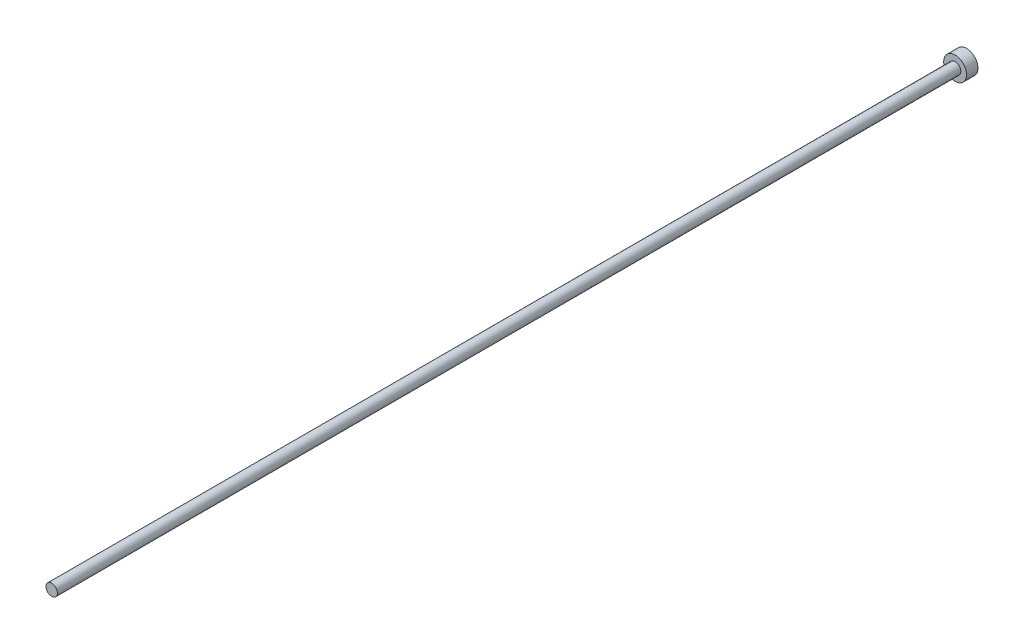
ISO-10303-21;
HEADER;
FILE_DESCRIPTION(('STEP AP214'),'2;1');
FILE_NAME('part.step','',(''),(''),'','','');
FILE_SCHEMA(('AUTOMOTIVE_DESIGN { 1 0 10303 214 1 1 1 1 }'));
ENDSEC;
DATA;
#1=APPLICATION_CONTEXT('core data for automotive mechanical design processes');
#2=APPLICATION_PROTOCOL_DEFINITION('international standard','automotive_design',2000,#1);
#3=PRODUCT_CONTEXT('',#1,'mechanical');
#4=PRODUCT('Part','Part','',(#3));
#5=PRODUCT_RELATED_PRODUCT_CATEGORY('part','',(#4));
#6=PRODUCT_DEFINITION_FORMATION('','',#4);
#7=PRODUCT_DEFINITION_CONTEXT('part definition',#1,'design');
#8=PRODUCT_DEFINITION('design','',#6,#7);
#9=PRODUCT_DEFINITION_SHAPE('','',#8);
#10=(LENGTH_UNIT() NAMED_UNIT(*) SI_UNIT(.MILLI.,.METRE.));
#11=(NAMED_UNIT(*) PLANE_ANGLE_UNIT() SI_UNIT($,.RADIAN.));
#12=(NAMED_UNIT(*) SI_UNIT($,.STERADIAN.) SOLID_ANGLE_UNIT());
#13=UNCERTAINTY_MEASURE_WITH_UNIT(LENGTH_MEASURE(1.E-05),#10,'distance_accuracy_value','');
#14=(GEOMETRIC_REPRESENTATION_CONTEXT(3) GLOBAL_UNCERTAINTY_ASSIGNED_CONTEXT((#13)) GLOBAL_UNIT_ASSIGNED_CONTEXT((#10,
#11,#12)) REPRESENTATION_CONTEXT('',''));
#15=CARTESIAN_POINT('',(0.,0.,0.));
#16=DIRECTION('',(0.,0.,1.));
#17=DIRECTION('',(1.,0.,0.));
#18=AXIS2_PLACEMENT_3D('',#15,#16,#17);
#19=CARTESIAN_POINT('',(0.,0.,-80.));
#20=DIRECTION('',(0.,0.,1.));
#21=DIRECTION('',(1.,0.,0.));
#22=AXIS2_PLACEMENT_3D('',#19,#20,#21);
#23=PLANE('',#22);
#24=CARTESIAN_POINT('',(0.,0.,-80.));
#25=DIRECTION('',(0.,0.,1.));
#26=DIRECTION('',(1.,0.,0.));
#27=AXIS2_PLACEMENT_3D('',#24,#25,#26);
#28=CIRCLE('',#27,2.);
#29=CARTESIAN_POINT('',(2.,0.,-80.));
#30=VERTEX_POINT('',#29);
#31=EDGE_CURVE('E10',#30,#30,#28,.T.);
#32=ORIENTED_EDGE('',*,*,#31,.F.);
#33=EDGE_LOOP('',(#32));
#34=FACE_BOUND('',#33,.T.);
#35=ADVANCED_FACE('F35',(#34),#23,.F.);
#36=CARTESIAN_POINT('',(0.,0.,80.));
#37=DIRECTION('',(0.,0.,1.));
#38=DIRECTION('',(1.,0.,0.));
#39=AXIS2_PLACEMENT_3D('',#36,#37,#38);
#40=CYLINDRICAL_SURFACE('',#39,2.);
#41=CARTESIAN_POINT('',(0.,0.,-78.));
#42=DIRECTION('',(0.,0.,1.));
#43=DIRECTION('',(1.,0.,0.));
#44=AXIS2_PLACEMENT_3D('',#41,#42,#43);
#45=CIRCLE('',#44,2.);
#46=CARTESIAN_POINT('',(2.,0.,-78.));
#47=VERTEX_POINT('',#46);
#48=EDGE_CURVE('E42',#47,#47,#45,.T.);
#49=ORIENTED_EDGE('',*,*,#48,.F.);
#50=EDGE_LOOP('',(#49));
#51=FACE_BOUND('',#50,.T.);
#52=ORIENTED_EDGE('',*,*,#31,.T.);
#53=EDGE_LOOP('',(#52));
#54=FACE_BOUND('',#53,.T.);
#55=ADVANCED_FACE('F68',(#51,#54),#40,.T.);
#56=CARTESIAN_POINT('',(0.,2.,-78.));
#57=DIRECTION('',(0.,0.,-1.));
#58=DIRECTION('',(-1.,0.,0.));
#59=AXIS2_PLACEMENT_3D('',#56,#57,#58);
#60=PLANE('',#59);
#61=CARTESIAN_POINT('',(0.,0.,-78.));
#62=DIRECTION('',(0.,0.,1.));
#63=DIRECTION('',(1.,0.,0.));
#64=AXIS2_PLACEMENT_3D('',#61,#62,#63);
#65=CIRCLE('',#64,1.00000000000002);
#66=CARTESIAN_POINT('',(1.00000000000002,0.,-78.));
#67=VERTEX_POINT('',#66);
#68=EDGE_CURVE('E48',#67,#67,#65,.T.);
#69=ORIENTED_EDGE('',*,*,#68,.F.);
#70=EDGE_LOOP('',(#69));
#71=FACE_BOUND('',#70,.T.);
#72=ORIENTED_EDGE('',*,*,#48,.T.);
#73=EDGE_LOOP('',(#72));
#74=FACE_BOUND('',#73,.T.);
#75=ADVANCED_FACE('F63',(#71,#74),#60,.F.);
#76=CARTESIAN_POINT('',(0.,0.,80.));
#77=DIRECTION('',(0.,0.,1.));
#78=DIRECTION('',(1.,0.,0.));
#79=AXIS2_PLACEMENT_3D('',#76,#77,#78);
#80=CYLINDRICAL_SURFACE('',#79,1.00000000000001);
#81=CARTESIAN_POINT('',(0.,0.,80.));
#82=DIRECTION('',(0.,0.,1.));
#83=DIRECTION('',(1.,0.,0.));
#84=AXIS2_PLACEMENT_3D('',#81,#82,#83);
#85=CIRCLE('',#84,0.999999999999999);
#86=CARTESIAN_POINT('',(0.999999999999999,0.,80.));
#87=VERTEX_POINT('',#86);
#88=EDGE_CURVE('E52',#87,#87,#85,.T.);
#89=ORIENTED_EDGE('',*,*,#88,.F.);
#90=EDGE_LOOP('',(#89));
#91=FACE_BOUND('',#90,.T.);
#92=ORIENTED_EDGE('',*,*,#68,.T.);
#93=EDGE_LOOP('',(#92));
#94=FACE_BOUND('',#93,.T.);
#95=ADVANCED_FACE('F60',(#91,#94),#80,.T.);
#96=CARTESIAN_POINT('',(0.,0.999999999999999,80.));
#97=DIRECTION('',(0.,0.,-1.));
#98=DIRECTION('',(-1.,0.,0.));
#99=AXIS2_PLACEMENT_3D('',#96,#97,#98);
#100=PLANE('',#99);
#101=ORIENTED_EDGE('',*,*,#88,.T.);
#102=EDGE_LOOP('',(#101));
#103=FACE_BOUND('',#102,.T.);
#104=ADVANCED_FACE('F58',(#103),#100,.F.);
#105=CLOSED_SHELL('',(#35,#55,#75,#95,#104));
#106=MANIFOLD_SOLID_BREP('B2',#105);
#107=ADVANCED_BREP_SHAPE_REPRESENTATION('',(#18,#106),#14);
#108=SHAPE_DEFINITION_REPRESENTATION(#9,#107);
ENDSEC;
END-ISO-10303-21;
